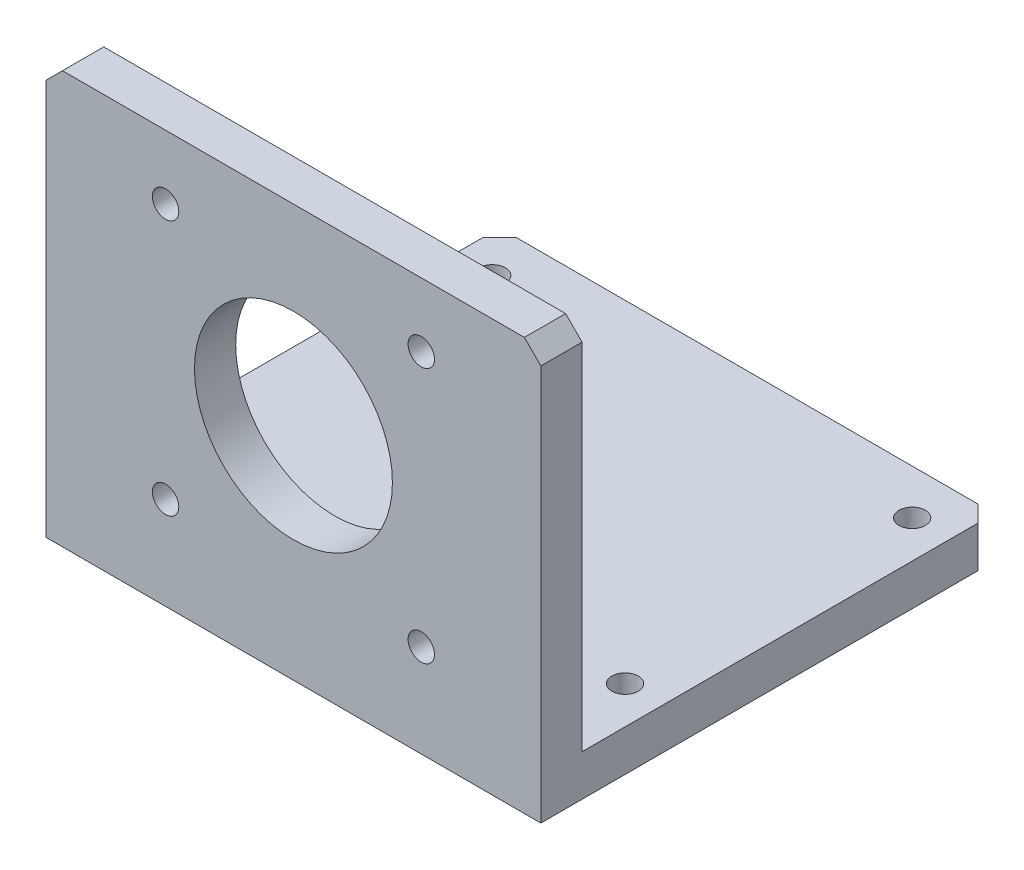
ISO-10303-21;
HEADER;
FILE_DESCRIPTION(('STEP AP214'),'2;1');
FILE_NAME('part.step','',(''),(''),'','','');
FILE_SCHEMA(('AUTOMOTIVE_DESIGN { 1 0 10303 214 1 1 1 1 }'));
ENDSEC;
DATA;
#1=APPLICATION_CONTEXT('core data for automotive mechanical design processes');
#2=APPLICATION_PROTOCOL_DEFINITION('international standard','automotive_design',2000,#1);
#3=PRODUCT_CONTEXT('',#1,'mechanical');
#4=PRODUCT('Part','Part','',(#3));
#5=PRODUCT_RELATED_PRODUCT_CATEGORY('part','',(#4));
#6=PRODUCT_DEFINITION_FORMATION('','',#4);
#7=PRODUCT_DEFINITION_CONTEXT('part definition',#1,'design');
#8=PRODUCT_DEFINITION('design','',#6,#7);
#9=PRODUCT_DEFINITION_SHAPE('','',#8);
#10=(LENGTH_UNIT() NAMED_UNIT(*) SI_UNIT(.MILLI.,.METRE.));
#11=(NAMED_UNIT(*) PLANE_ANGLE_UNIT() SI_UNIT($,.RADIAN.));
#12=(NAMED_UNIT(*) SI_UNIT($,.STERADIAN.) SOLID_ANGLE_UNIT());
#13=UNCERTAINTY_MEASURE_WITH_UNIT(LENGTH_MEASURE(1.E-05),#10,'distance_accuracy_value','');
#14=(GEOMETRIC_REPRESENTATION_CONTEXT(3) GLOBAL_UNCERTAINTY_ASSIGNED_CONTEXT((#13)) GLOBAL_UNIT_ASSIGNED_CONTEXT((#10,
#11,#12)) REPRESENTATION_CONTEXT('',''));
#15=CARTESIAN_POINT('',(0.,0.,0.));
#16=DIRECTION('',(0.,0.,1.));
#17=DIRECTION('',(1.,0.,0.));
#18=AXIS2_PLACEMENT_3D('',#15,#16,#17);
#19=CARTESIAN_POINT('',(60.,5.,-5.));
#20=DIRECTION('',(0.,-1.,0.));
#21=DIRECTION('',(0.,0.,-1.));
#22=AXIS2_PLACEMENT_3D('',#19,#20,#21);
#23=PLANE('',#22);
#24=CARTESIAN_POINT('',(55.4592592592593,5.,-14.7490421455937));
#25=DIRECTION('',(0.,1.,0.));
#26=DIRECTION('',(0.,0.,1.));
#27=AXIS2_PLACEMENT_3D('',#24,#25,#26);
#28=CIRCLE('',#27,1.60000000000002);
#29=CARTESIAN_POINT('',(55.4592592592593,5.,-13.1490421455937));
#30=VERTEX_POINT('',#29);
#31=EDGE_CURVE('E305',#30,#30,#28,.T.);
#32=ORIENTED_EDGE('',*,*,#31,.F.);
#33=EDGE_LOOP('',(#32));
#34=FACE_BOUND('',#33,.T.);
#35=CARTESIAN_POINT('',(4.54074074074073,5.,-49.5574712643677));
#36=DIRECTION('',(0.,1.,0.));
#37=DIRECTION('',(0.,0.,1.));
#38=AXIS2_PLACEMENT_3D('',#35,#36,#37);
#39=CIRCLE('',#38,1.60000000000001);
#40=CARTESIAN_POINT('',(4.54074074074073,5.,-47.9574712643676));
#41=VERTEX_POINT('',#40);
#42=EDGE_CURVE('E281',#41,#41,#39,.T.);
#43=ORIENTED_EDGE('',*,*,#42,.F.);
#44=EDGE_LOOP('',(#43));
#45=FACE_BOUND('',#44,.T.);
#46=CARTESIAN_POINT('',(4.54074074074073,5.,-14.7490421455937));
#47=DIRECTION('',(0.,1.,0.));
#48=DIRECTION('',(0.,0.,1.));
#49=AXIS2_PLACEMENT_3D('',#46,#47,#48);
#50=CIRCLE('',#49,1.60000000000001);
#51=CARTESIAN_POINT('',(4.54074074074073,5.,-13.1490421455937));
#52=VERTEX_POINT('',#51);
#53=EDGE_CURVE('E289',#52,#52,#50,.T.);
#54=ORIENTED_EDGE('',*,*,#53,.F.);
#55=EDGE_LOOP('',(#54));
#56=FACE_BOUND('',#55,.T.);
#57=CARTESIAN_POINT('',(55.4592592592593,5.,-49.5574712643677));
#58=DIRECTION('',(0.,1.,0.));
#59=DIRECTION('',(0.,0.,1.));
#60=AXIS2_PLACEMENT_3D('',#57,#58,#59);
#61=CIRCLE('',#60,1.60000000000002);
#62=CARTESIAN_POINT('',(55.4592592592593,5.,-47.9574712643676));
#63=VERTEX_POINT('',#62);
#64=EDGE_CURVE('E297',#63,#63,#61,.T.);
#65=ORIENTED_EDGE('',*,*,#64,.F.);
#66=EDGE_LOOP('',(#65));
#67=FACE_BOUND('',#66,.T.);
#68=DIRECTION('',(0.,0.,1.));
#69=VECTOR('',#68,1.);
#70=CARTESIAN_POINT('',(60.,5.,-5.));
#71=LINE('',#70,#69);
#72=CARTESIAN_POINT('',(60.,5.,-53.));
#73=VERTEX_POINT('',#72);
#74=CARTESIAN_POINT('',(60.,5.,-5.));
#75=VERTEX_POINT('',#74);
#76=EDGE_CURVE('E119',#73,#75,#71,.T.);
#77=ORIENTED_EDGE('',*,*,#76,.F.);
#78=DIRECTION('',(0.707106781186548,0.,0.707106781186548));
#79=VECTOR('',#78,1.);
#80=CARTESIAN_POINT('',(58.,5.,-55.));
#81=LINE('',#80,#79);
#82=CARTESIAN_POINT('',(58.,5.,-55.));
#83=VERTEX_POINT('',#82);
#84=EDGE_CURVE('E212',#73,#83,#81,.F.);
#85=ORIENTED_EDGE('',*,*,#84,.T.);
#86=DIRECTION('',(1.,0.,0.));
#87=VECTOR('',#86,1.);
#88=CARTESIAN_POINT('',(60.,5.,-55.));
#89=LINE('',#88,#87);
#90=CARTESIAN_POINT('',(2.00000000000002,5.,-55.));
#91=VERTEX_POINT('',#90);
#92=EDGE_CURVE('E309',#91,#83,#89,.T.);
#93=ORIENTED_EDGE('',*,*,#92,.F.);
#94=DIRECTION('',(-0.707106781186548,0.,0.707106781186548));
#95=VECTOR('',#94,1.);
#96=CARTESIAN_POINT('',(2.00000000000002,5.,-55.));
#97=LINE('',#96,#95);
#98=CARTESIAN_POINT('',(0.,5.,-53.));
#99=VERTEX_POINT('',#98);
#100=EDGE_CURVE('E209',#91,#99,#97,.T.);
#101=ORIENTED_EDGE('',*,*,#100,.T.);
#102=DIRECTION('',(0.,0.,1.));
#103=VECTOR('',#102,1.);
#104=CARTESIAN_POINT('',(0.,5.,-5.));
#105=LINE('',#104,#103);
#106=CARTESIAN_POINT('',(0.,5.,-5.));
#107=VERTEX_POINT('',#106);
#108=EDGE_CURVE('E137',#99,#107,#105,.T.);
#109=ORIENTED_EDGE('',*,*,#108,.T.);
#110=DIRECTION('',(-1.,0.,0.));
#111=VECTOR('',#110,1.);
#112=CARTESIAN_POINT('',(60.,5.,-5.));
#113=LINE('',#112,#111);
#114=EDGE_CURVE('E135',#75,#107,#113,.T.);
#115=ORIENTED_EDGE('',*,*,#114,.F.);
#116=EDGE_LOOP('',(#77,#85,#93,#101,#109,#115));
#117=FACE_BOUND('',#116,.T.);
#118=ADVANCED_FACE('F40',(#34,#45,#56,#67,#117),#23,.F.);
#119=CARTESIAN_POINT('',(60.,0.,0.));
#120=DIRECTION('',(0.,1.,0.));
#121=DIRECTION('',(0.,0.,1.));
#122=AXIS2_PLACEMENT_3D('',#119,#120,#121);
#123=PLANE('',#122);
#124=CARTESIAN_POINT('',(4.54074074074073,0.,-49.5574712643677));
#125=DIRECTION('',(0.,1.,0.));
#126=DIRECTION('',(0.,0.,1.));
#127=AXIS2_PLACEMENT_3D('',#124,#125,#126);
#128=CIRCLE('',#127,1.60000000000001);
#129=CARTESIAN_POINT('',(4.54074074074073,0.,-47.9574712643676));
#130=VERTEX_POINT('',#129);
#131=EDGE_CURVE('E277',#130,#130,#128,.T.);
#132=ORIENTED_EDGE('',*,*,#131,.T.);
#133=EDGE_LOOP('',(#132));
#134=FACE_BOUND('',#133,.T.);
#135=CARTESIAN_POINT('',(4.54074074074073,0.,-14.7490421455937));
#136=DIRECTION('',(0.,1.,0.));
#137=DIRECTION('',(0.,0.,1.));
#138=AXIS2_PLACEMENT_3D('',#135,#136,#137);
#139=CIRCLE('',#138,1.60000000000001);
#140=CARTESIAN_POINT('',(4.54074074074073,0.,-13.1490421455937));
#141=VERTEX_POINT('',#140);
#142=EDGE_CURVE('E285',#141,#141,#139,.T.);
#143=ORIENTED_EDGE('',*,*,#142,.T.);
#144=EDGE_LOOP('',(#143));
#145=FACE_BOUND('',#144,.T.);
#146=CARTESIAN_POINT('',(55.4592592592593,0.,-49.5574712643677));
#147=DIRECTION('',(0.,1.,0.));
#148=DIRECTION('',(0.,0.,1.));
#149=AXIS2_PLACEMENT_3D('',#146,#147,#148);
#150=CIRCLE('',#149,1.60000000000001);
#151=CARTESIAN_POINT('',(55.4592592592593,0.,-47.9574712643676));
#152=VERTEX_POINT('',#151);
#153=EDGE_CURVE('E293',#152,#152,#150,.T.);
#154=ORIENTED_EDGE('',*,*,#153,.T.);
#155=EDGE_LOOP('',(#154));
#156=FACE_BOUND('',#155,.T.);
#157=CARTESIAN_POINT('',(55.4592592592593,0.,-14.7490421455937));
#158=DIRECTION('',(0.,1.,0.));
#159=DIRECTION('',(0.,0.,1.));
#160=AXIS2_PLACEMENT_3D('',#157,#158,#159);
#161=CIRCLE('',#160,1.60000000000001);
#162=CARTESIAN_POINT('',(55.4592592592593,0.,-13.1490421455937));
#163=VERTEX_POINT('',#162);
#164=EDGE_CURVE('E301',#163,#163,#161,.T.);
#165=ORIENTED_EDGE('',*,*,#164,.T.);
#166=EDGE_LOOP('',(#165));
#167=FACE_BOUND('',#166,.T.);
#168=DIRECTION('',(-1.,0.,0.));
#169=VECTOR('',#168,1.);
#170=CARTESIAN_POINT('',(60.,0.,-55.));
#171=LINE('',#170,#169);
#172=CARTESIAN_POINT('',(58.,0.,-55.));
#173=VERTEX_POINT('',#172);
#174=CARTESIAN_POINT('',(2.00000000000002,0.,-55.));
#175=VERTEX_POINT('',#174);
#176=EDGE_CURVE('E313',#173,#175,#171,.T.);
#177=ORIENTED_EDGE('',*,*,#176,.F.);
#178=DIRECTION('',(-0.707106781186548,0.,-0.707106781186548));
#179=VECTOR('',#178,1.);
#180=CARTESIAN_POINT('',(58.,0.,-55.));
#181=LINE('',#180,#179);
#182=CARTESIAN_POINT('',(60.,0.,-53.));
#183=VERTEX_POINT('',#182);
#184=EDGE_CURVE('E201',#173,#183,#181,.F.);
#185=ORIENTED_EDGE('',*,*,#184,.T.);
#186=DIRECTION('',(0.,0.,-1.));
#187=VECTOR('',#186,1.);
#188=CARTESIAN_POINT('',(60.,0.,0.));
#189=LINE('',#188,#187);
#190=CARTESIAN_POINT('',(60.,0.,0.));
#191=VERTEX_POINT('',#190);
#192=EDGE_CURVE('E132',#191,#183,#189,.T.);
#193=ORIENTED_EDGE('',*,*,#192,.F.);
#194=DIRECTION('',(-1.,0.,0.));
#195=VECTOR('',#194,1.);
#196=CARTESIAN_POINT('',(60.,0.,0.));
#197=LINE('',#196,#195);
#198=CARTESIAN_POINT('',(0.,0.,0.));
#199=VERTEX_POINT('',#198);
#200=EDGE_CURVE('E149',#191,#199,#197,.T.);
#201=ORIENTED_EDGE('',*,*,#200,.T.);
#202=DIRECTION('',(0.,0.,-1.));
#203=VECTOR('',#202,1.);
#204=CARTESIAN_POINT('',(0.,0.,0.));
#205=LINE('',#204,#203);
#206=CARTESIAN_POINT('',(0.,0.,-53.));
#207=VERTEX_POINT('',#206);
#208=EDGE_CURVE('E153',#199,#207,#205,.T.);
#209=ORIENTED_EDGE('',*,*,#208,.T.);
#210=DIRECTION('',(0.707106781186548,0.,-0.707106781186548));
#211=VECTOR('',#210,1.);
#212=CARTESIAN_POINT('',(2.00000000000002,0.,-55.));
#213=LINE('',#212,#211);
#214=EDGE_CURVE('E198',#207,#175,#213,.T.);
#215=ORIENTED_EDGE('',*,*,#214,.T.);
#216=EDGE_LOOP('',(#177,#185,#193,#201,#209,#215));
#217=FACE_BOUND('',#216,.T.);
#218=ADVANCED_FACE('F251',(#134,#145,#156,#167,#217),#123,.F.);
#219=CARTESIAN_POINT('',(60.,0.,0.));
#220=DIRECTION('',(1.,0.,0.));
#221=DIRECTION('',(0.,0.,-1.));
#222=AXIS2_PLACEMENT_3D('',#219,#220,#221);
#223=PLANE('',#222);
#224=ORIENTED_EDGE('',*,*,#192,.T.);
#225=DIRECTION('',(0.,1.,0.));
#226=VECTOR('',#225,1.);
#227=CARTESIAN_POINT('',(60.,0.,-53.));
#228=LINE('',#227,#226);
#229=EDGE_CURVE('E128',#183,#73,#228,.T.);
#230=ORIENTED_EDGE('',*,*,#229,.T.);
#231=ORIENTED_EDGE('',*,*,#76,.T.);
#232=DIRECTION('',(0.,1.,0.));
#233=VECTOR('',#232,1.);
#234=CARTESIAN_POINT('',(60.,50.,-5.));
#235=LINE('',#234,#233);
#236=CARTESIAN_POINT('',(60.,48.,-5.));
#237=VERTEX_POINT('',#236);
#238=EDGE_CURVE('E125',#75,#237,#235,.T.);
#239=ORIENTED_EDGE('',*,*,#238,.T.);
#240=DIRECTION('',(0.,0.,1.));
#241=VECTOR('',#240,1.);
#242=CARTESIAN_POINT('',(60.,48.,0.));
#243=LINE('',#242,#241);
#244=CARTESIAN_POINT('',(60.,48.,0.));
#245=VERTEX_POINT('',#244);
#246=EDGE_CURVE('E204',#237,#245,#243,.T.);
#247=ORIENTED_EDGE('',*,*,#246,.T.);
#248=DIRECTION('',(0.,-1.,0.));
#249=VECTOR('',#248,1.);
#250=CARTESIAN_POINT('',(60.,0.,0.));
#251=LINE('',#250,#249);
#252=EDGE_CURVE('E146',#245,#191,#251,.T.);
#253=ORIENTED_EDGE('',*,*,#252,.T.);
#254=EDGE_LOOP('',(#224,#230,#231,#239,#247,#253));
#255=FACE_BOUND('',#254,.T.);
#256=ADVANCED_FACE('F122',(#255),#223,.T.);
#257=CARTESIAN_POINT('',(0.,0.,0.));
#258=DIRECTION('',(1.,0.,0.));
#259=DIRECTION('',(0.,0.,-1.));
#260=AXIS2_PLACEMENT_3D('',#257,#258,#259);
#261=PLANE('',#260);
#262=ORIENTED_EDGE('',*,*,#108,.F.);
#263=DIRECTION('',(0.,-1.,0.));
#264=VECTOR('',#263,1.);
#265=CARTESIAN_POINT('',(0.,0.,-53.));
#266=LINE('',#265,#264);
#267=EDGE_CURVE('E218',#99,#207,#266,.T.);
#268=ORIENTED_EDGE('',*,*,#267,.T.);
#269=ORIENTED_EDGE('',*,*,#208,.F.);
#270=DIRECTION('',(0.,-1.,0.));
#271=VECTOR('',#270,1.);
#272=CARTESIAN_POINT('',(0.,0.,0.));
#273=LINE('',#272,#271);
#274=CARTESIAN_POINT('',(0.,48.,0.));
#275=VERTEX_POINT('',#274);
#276=EDGE_CURVE('E163',#275,#199,#273,.T.);
#277=ORIENTED_EDGE('',*,*,#276,.F.);
#278=DIRECTION('',(0.,0.,-1.));
#279=VECTOR('',#278,1.);
#280=CARTESIAN_POINT('',(0.,48.,0.));
#281=LINE('',#280,#279);
#282=CARTESIAN_POINT('',(0.,48.,-5.));
#283=VERTEX_POINT('',#282);
#284=EDGE_CURVE('E215',#275,#283,#281,.T.);
#285=ORIENTED_EDGE('',*,*,#284,.T.);
#286=DIRECTION('',(0.,1.,0.));
#287=VECTOR('',#286,1.);
#288=CARTESIAN_POINT('',(0.,50.,-5.));
#289=LINE('',#288,#287);
#290=EDGE_CURVE('E160',#107,#283,#289,.T.);
#291=ORIENTED_EDGE('',*,*,#290,.F.);
#292=EDGE_LOOP('',(#262,#268,#269,#277,#285,#291));
#293=FACE_BOUND('',#292,.T.);
#294=ADVANCED_FACE('F243',(#293),#261,.F.);
#295=CARTESIAN_POINT('',(60.,0.,0.));
#296=DIRECTION('',(0.,0.,-1.));
#297=DIRECTION('',(-1.,0.,0.));
#298=AXIS2_PLACEMENT_3D('',#295,#296,#297);
#299=PLANE('',#298);
#300=CARTESIAN_POINT('',(14.5,42.25,0.));
#301=DIRECTION('',(0.,0.,1.));
#302=DIRECTION('',(1.,0.,0.));
#303=AXIS2_PLACEMENT_3D('',#300,#301,#302);
#304=CIRCLE('',#303,1.60000000000001);
#305=CARTESIAN_POINT('',(16.1,42.25,0.));
#306=VERTEX_POINT('',#305);
#307=EDGE_CURVE('E190',#306,#306,#304,.T.);
#308=ORIENTED_EDGE('',*,*,#307,.F.);
#309=EDGE_LOOP('',(#308));
#310=FACE_BOUND('',#309,.T.);
#311=CARTESIAN_POINT('',(45.5,42.25,0.));
#312=DIRECTION('',(0.,0.,1.));
#313=DIRECTION('',(1.,0.,0.));
#314=AXIS2_PLACEMENT_3D('',#311,#312,#313);
#315=CIRCLE('',#314,1.60000000000001);
#316=CARTESIAN_POINT('',(47.1,42.25,0.));
#317=VERTEX_POINT('',#316);
#318=EDGE_CURVE('E185',#317,#317,#315,.T.);
#319=ORIENTED_EDGE('',*,*,#318,.F.);
#320=EDGE_LOOP('',(#319));
#321=FACE_BOUND('',#320,.T.);
#322=CARTESIAN_POINT('',(45.5,11.25,0.));
#323=DIRECTION('',(0.,0.,1.));
#324=DIRECTION('',(1.,0.,0.));
#325=AXIS2_PLACEMENT_3D('',#322,#323,#324);
#326=CIRCLE('',#325,1.60000000000001);
#327=CARTESIAN_POINT('',(47.1,11.25,0.));
#328=VERTEX_POINT('',#327);
#329=EDGE_CURVE('E180',#328,#328,#326,.T.);
#330=ORIENTED_EDGE('',*,*,#329,.F.);
#331=EDGE_LOOP('',(#330));
#332=FACE_BOUND('',#331,.T.);
#333=CARTESIAN_POINT('',(14.5,11.25,0.));
#334=DIRECTION('',(0.,0.,1.));
#335=DIRECTION('',(1.,0.,0.));
#336=AXIS2_PLACEMENT_3D('',#333,#334,#335);
#337=CIRCLE('',#336,1.60000000000001);
#338=CARTESIAN_POINT('',(16.1,11.25,0.));
#339=VERTEX_POINT('',#338);
#340=EDGE_CURVE('E179',#339,#339,#337,.T.);
#341=ORIENTED_EDGE('',*,*,#340,.F.);
#342=EDGE_LOOP('',(#341));
#343=FACE_BOUND('',#342,.T.);
#344=DIRECTION('',(-1.,0.,0.));
#345=VECTOR('',#344,1.);
#346=CARTESIAN_POINT('',(60.,50.,0.));
#347=LINE('',#346,#345);
#348=CARTESIAN_POINT('',(58.,50.,0.));
#349=VERTEX_POINT('',#348);
#350=CARTESIAN_POINT('',(2.00000000000002,50.,0.));
#351=VERTEX_POINT('',#350);
#352=EDGE_CURVE('E169',#349,#351,#347,.T.);
#353=ORIENTED_EDGE('',*,*,#352,.T.);
#354=DIRECTION('',(0.707106781186547,0.707106781186547,0.));
#355=VECTOR('',#354,1.);
#356=CARTESIAN_POINT('',(2.00000000000002,50.,0.));
#357=LINE('',#356,#355);
#358=EDGE_CURVE('E230',#351,#275,#357,.F.);
#359=ORIENTED_EDGE('',*,*,#358,.T.);
#360=ORIENTED_EDGE('',*,*,#276,.T.);
#361=ORIENTED_EDGE('',*,*,#200,.F.);
#362=ORIENTED_EDGE('',*,*,#252,.F.);
#363=DIRECTION('',(-0.707106781186547,0.707106781186547,0.));
#364=VECTOR('',#363,1.);
#365=CARTESIAN_POINT('',(60.,48.,0.));
#366=LINE('',#365,#364);
#367=EDGE_CURVE('E227',#245,#349,#366,.T.);
#368=ORIENTED_EDGE('',*,*,#367,.T.);
#369=EDGE_LOOP('',(#353,#359,#360,#361,#362,#368));
#370=FACE_BOUND('',#369,.T.);
#371=CARTESIAN_POINT('',(30.,26.75,0.));
#372=DIRECTION('',(0.,0.,1.));
#373=DIRECTION('',(1.,0.,0.));
#374=AXIS2_PLACEMENT_3D('',#371,#372,#373);
#375=CIRCLE('',#374,12.);
#376=CARTESIAN_POINT('',(42.,26.75,0.));
#377=VERTEX_POINT('',#376);
#378=EDGE_CURVE('E257',#377,#377,#375,.T.);
#379=ORIENTED_EDGE('',*,*,#378,.F.);
#380=EDGE_LOOP('',(#379));
#381=FACE_BOUND('',#380,.T.);
#382=ADVANCED_FACE('F235',(#310,#321,#332,#343,#370,#381),#299,.F.);
#383=CARTESIAN_POINT('',(60.,50.,-5.));
#384=DIRECTION('',(0.,0.,1.));
#385=DIRECTION('',(0.,-1.,0.));
#386=AXIS2_PLACEMENT_3D('',#383,#384,#385);
#387=PLANE('',#386);
#388=CARTESIAN_POINT('',(14.5,42.25,-5.));
#389=DIRECTION('',(0.,0.,1.));
#390=DIRECTION('',(0.,-1.,0.));
#391=AXIS2_PLACEMENT_3D('',#388,#389,#390);
#392=CIRCLE('',#391,1.60000000000001);
#393=CARTESIAN_POINT('',(14.5,40.65,-5.));
#394=VERTEX_POINT('',#393);
#395=EDGE_CURVE('E186',#394,#394,#392,.T.);
#396=ORIENTED_EDGE('',*,*,#395,.T.);
#397=EDGE_LOOP('',(#396));
#398=FACE_BOUND('',#397,.T.);
#399=CARTESIAN_POINT('',(45.5,42.25,-5.));
#400=DIRECTION('',(0.,0.,1.));
#401=DIRECTION('',(0.,-1.,0.));
#402=AXIS2_PLACEMENT_3D('',#399,#400,#401);
#403=CIRCLE('',#402,1.60000000000001);
#404=CARTESIAN_POINT('',(45.5,40.65,-5.));
#405=VERTEX_POINT('',#404);
#406=EDGE_CURVE('E181',#405,#405,#403,.T.);
#407=ORIENTED_EDGE('',*,*,#406,.T.);
#408=EDGE_LOOP('',(#407));
#409=FACE_BOUND('',#408,.T.);
#410=CARTESIAN_POINT('',(45.5,11.25,-5.));
#411=DIRECTION('',(0.,0.,1.));
#412=DIRECTION('',(0.,-1.,0.));
#413=AXIS2_PLACEMENT_3D('',#410,#411,#412);
#414=CIRCLE('',#413,1.60000000000001);
#415=CARTESIAN_POINT('',(45.5,9.65000000000002,-5.));
#416=VERTEX_POINT('',#415);
#417=EDGE_CURVE('E175',#416,#416,#414,.T.);
#418=ORIENTED_EDGE('',*,*,#417,.T.);
#419=EDGE_LOOP('',(#418));
#420=FACE_BOUND('',#419,.T.);
#421=CARTESIAN_POINT('',(14.5,11.25,-5.));
#422=DIRECTION('',(0.,0.,1.));
#423=DIRECTION('',(0.,-1.,0.));
#424=AXIS2_PLACEMENT_3D('',#421,#422,#423);
#425=CIRCLE('',#424,1.60000000000001);
#426=CARTESIAN_POINT('',(14.5,9.65000000000002,-5.));
#427=VERTEX_POINT('',#426);
#428=EDGE_CURVE('E261',#427,#427,#425,.T.);
#429=ORIENTED_EDGE('',*,*,#428,.T.);
#430=EDGE_LOOP('',(#429));
#431=FACE_BOUND('',#430,.T.);
#432=CARTESIAN_POINT('',(30.,26.75,-5.));
#433=DIRECTION('',(0.,0.,1.));
#434=DIRECTION('',(0.,-1.,0.));
#435=AXIS2_PLACEMENT_3D('',#432,#433,#434);
#436=CIRCLE('',#435,12.);
#437=CARTESIAN_POINT('',(30.,14.75,-5.));
#438=VERTEX_POINT('',#437);
#439=EDGE_CURVE('E157',#438,#438,#436,.T.);
#440=ORIENTED_EDGE('',*,*,#439,.T.);
#441=EDGE_LOOP('',(#440));
#442=FACE_BOUND('',#441,.T.);
#443=ORIENTED_EDGE('',*,*,#290,.T.);
#444=DIRECTION('',(-0.707106781186547,-0.707106781186547,0.));
#445=VECTOR('',#444,1.);
#446=CARTESIAN_POINT('',(2.00000000000002,50.,-5.));
#447=LINE('',#446,#445);
#448=CARTESIAN_POINT('',(2.00000000000002,50.,-5.));
#449=VERTEX_POINT('',#448);
#450=EDGE_CURVE('E11',#283,#449,#447,.F.);
#451=ORIENTED_EDGE('',*,*,#450,.T.);
#452=DIRECTION('',(-1.,0.,0.));
#453=VECTOR('',#452,1.);
#454=CARTESIAN_POINT('',(60.,50.,-5.));
#455=LINE('',#454,#453);
#456=CARTESIAN_POINT('',(58.,50.,-5.));
#457=VERTEX_POINT('',#456);
#458=EDGE_CURVE('E141',#457,#449,#455,.T.);
#459=ORIENTED_EDGE('',*,*,#458,.F.);
#460=DIRECTION('',(0.707106781186547,-0.707106781186547,0.));
#461=VECTOR('',#460,1.);
#462=CARTESIAN_POINT('',(60.,48.,-5.));
#463=LINE('',#462,#461);
#464=EDGE_CURVE('E50',#457,#237,#463,.T.);
#465=ORIENTED_EDGE('',*,*,#464,.T.);
#466=ORIENTED_EDGE('',*,*,#238,.F.);
#467=ORIENTED_EDGE('',*,*,#114,.T.);
#468=EDGE_LOOP('',(#443,#451,#459,#465,#466,#467));
#469=FACE_BOUND('',#468,.T.);
#470=ADVANCED_FACE('F143',(#398,#409,#420,#431,#442,#469),#387,.F.);
#471=CARTESIAN_POINT('',(60.,50.,0.));
#472=DIRECTION('',(0.,-1.,0.));
#473=DIRECTION('',(0.,0.,-1.));
#474=AXIS2_PLACEMENT_3D('',#471,#472,#473);
#475=PLANE('',#474);
#476=ORIENTED_EDGE('',*,*,#458,.T.);
#477=DIRECTION('',(0.,0.,1.));
#478=VECTOR('',#477,1.);
#479=CARTESIAN_POINT('',(2.00000000000002,50.,0.));
#480=LINE('',#479,#478);
#481=EDGE_CURVE('E223',#449,#351,#480,.T.);
#482=ORIENTED_EDGE('',*,*,#481,.T.);
#483=ORIENTED_EDGE('',*,*,#352,.F.);
#484=DIRECTION('',(0.,0.,-1.));
#485=VECTOR('',#484,1.);
#486=CARTESIAN_POINT('',(58.,50.,-5.));
#487=LINE('',#486,#485);
#488=EDGE_CURVE('E62',#349,#457,#487,.T.);
#489=ORIENTED_EDGE('',*,*,#488,.T.);
#490=EDGE_LOOP('',(#476,#482,#483,#489));
#491=FACE_BOUND('',#490,.T.);
#492=ADVANCED_FACE('F245',(#491),#475,.F.);
#493=CARTESIAN_POINT('',(30.,26.75,0.));
#494=DIRECTION('',(0.,0.,1.));
#495=DIRECTION('',(1.,0.,0.));
#496=AXIS2_PLACEMENT_3D('',#493,#494,#495);
#497=CYLINDRICAL_SURFACE('',#496,12.);
#498=ORIENTED_EDGE('',*,*,#378,.T.);
#499=EDGE_LOOP('',(#498));
#500=FACE_BOUND('',#499,.T.);
#501=ORIENTED_EDGE('',*,*,#439,.F.);
#502=EDGE_LOOP('',(#501));
#503=FACE_BOUND('',#502,.T.);
#504=ADVANCED_FACE('F354',(#500,#503),#497,.F.);
#505=CARTESIAN_POINT('',(14.5,11.25,0.));
#506=DIRECTION('',(0.,0.,1.));
#507=DIRECTION('',(1.,0.,0.));
#508=AXIS2_PLACEMENT_3D('',#505,#506,#507);
#509=CYLINDRICAL_SURFACE('',#508,1.60000000000001);
#510=ORIENTED_EDGE('',*,*,#340,.T.);
#511=EDGE_LOOP('',(#510));
#512=FACE_BOUND('',#511,.T.);
#513=ORIENTED_EDGE('',*,*,#428,.F.);
#514=EDGE_LOOP('',(#513));
#515=FACE_BOUND('',#514,.T.);
#516=ADVANCED_FACE('F364',(#512,#515),#509,.F.);
#517=CARTESIAN_POINT('',(45.5,11.25,0.));
#518=DIRECTION('',(0.,0.,1.));
#519=DIRECTION('',(1.,0.,0.));
#520=AXIS2_PLACEMENT_3D('',#517,#518,#519);
#521=CYLINDRICAL_SURFACE('',#520,1.60000000000001);
#522=ORIENTED_EDGE('',*,*,#329,.T.);
#523=EDGE_LOOP('',(#522));
#524=FACE_BOUND('',#523,.T.);
#525=ORIENTED_EDGE('',*,*,#417,.F.);
#526=EDGE_LOOP('',(#525));
#527=FACE_BOUND('',#526,.T.);
#528=ADVANCED_FACE('F368',(#524,#527),#521,.F.);
#529=CARTESIAN_POINT('',(45.5,42.25,0.));
#530=DIRECTION('',(0.,0.,1.));
#531=DIRECTION('',(1.,0.,0.));
#532=AXIS2_PLACEMENT_3D('',#529,#530,#531);
#533=CYLINDRICAL_SURFACE('',#532,1.60000000000001);
#534=ORIENTED_EDGE('',*,*,#318,.T.);
#535=EDGE_LOOP('',(#534));
#536=FACE_BOUND('',#535,.T.);
#537=ORIENTED_EDGE('',*,*,#406,.F.);
#538=EDGE_LOOP('',(#537));
#539=FACE_BOUND('',#538,.T.);
#540=ADVANCED_FACE('F372',(#536,#539),#533,.F.);
#541=CARTESIAN_POINT('',(14.5,42.25,0.));
#542=DIRECTION('',(0.,0.,1.));
#543=DIRECTION('',(1.,0.,0.));
#544=AXIS2_PLACEMENT_3D('',#541,#542,#543);
#545=CYLINDRICAL_SURFACE('',#544,1.60000000000001);
#546=ORIENTED_EDGE('',*,*,#307,.T.);
#547=EDGE_LOOP('',(#546));
#548=FACE_BOUND('',#547,.T.);
#549=ORIENTED_EDGE('',*,*,#395,.F.);
#550=EDGE_LOOP('',(#549));
#551=FACE_BOUND('',#550,.T.);
#552=ADVANCED_FACE('F376',(#548,#551),#545,.F.);
#553=CARTESIAN_POINT('',(4.54074074074073,5.,-49.5574712643677));
#554=DIRECTION('',(0.,1.,0.));
#555=DIRECTION('',(0.,0.,1.));
#556=AXIS2_PLACEMENT_3D('',#553,#554,#555);
#557=CYLINDRICAL_SURFACE('',#556,1.60000000000001);
#558=ORIENTED_EDGE('',*,*,#131,.F.);
#559=EDGE_LOOP('',(#558));
#560=FACE_BOUND('',#559,.T.);
#561=ORIENTED_EDGE('',*,*,#42,.T.);
#562=EDGE_LOOP('',(#561));
#563=FACE_BOUND('',#562,.T.);
#564=ADVANCED_FACE('F380',(#560,#563),#557,.F.);
#565=CARTESIAN_POINT('',(4.54074074074073,5.,-14.7490421455937));
#566=DIRECTION('',(0.,1.,0.));
#567=DIRECTION('',(0.,0.,1.));
#568=AXIS2_PLACEMENT_3D('',#565,#566,#567);
#569=CYLINDRICAL_SURFACE('',#568,1.60000000000001);
#570=ORIENTED_EDGE('',*,*,#142,.F.);
#571=EDGE_LOOP('',(#570));
#572=FACE_BOUND('',#571,.T.);
#573=ORIENTED_EDGE('',*,*,#53,.T.);
#574=EDGE_LOOP('',(#573));
#575=FACE_BOUND('',#574,.T.);
#576=ADVANCED_FACE('F384',(#572,#575),#569,.F.);
#577=CARTESIAN_POINT('',(55.4592592592593,5.,-49.5574712643677));
#578=DIRECTION('',(0.,1.,0.));
#579=DIRECTION('',(0.,0.,1.));
#580=AXIS2_PLACEMENT_3D('',#577,#578,#579);
#581=CYLINDRICAL_SURFACE('',#580,1.60000000000001);
#582=ORIENTED_EDGE('',*,*,#153,.F.);
#583=EDGE_LOOP('',(#582));
#584=FACE_BOUND('',#583,.T.);
#585=ORIENTED_EDGE('',*,*,#64,.T.);
#586=EDGE_LOOP('',(#585));
#587=FACE_BOUND('',#586,.T.);
#588=ADVANCED_FACE('F388',(#584,#587),#581,.F.);
#589=CARTESIAN_POINT('',(55.4592592592593,5.,-14.7490421455937));
#590=DIRECTION('',(0.,1.,0.));
#591=DIRECTION('',(0.,0.,1.));
#592=AXIS2_PLACEMENT_3D('',#589,#590,#591);
#593=CYLINDRICAL_SURFACE('',#592,1.60000000000001);
#594=ORIENTED_EDGE('',*,*,#164,.F.);
#595=EDGE_LOOP('',(#594));
#596=FACE_BOUND('',#595,.T.);
#597=ORIENTED_EDGE('',*,*,#31,.T.);
#598=EDGE_LOOP('',(#597));
#599=FACE_BOUND('',#598,.T.);
#600=ADVANCED_FACE('F334',(#596,#599),#593,.F.);
#601=CARTESIAN_POINT('',(0.,0.,-55.));
#602=DIRECTION('',(0.,0.,-1.));
#603=DIRECTION('',(-1.,0.,0.));
#604=AXIS2_PLACEMENT_3D('',#601,#602,#603);
#605=PLANE('',#604);
#606=ORIENTED_EDGE('',*,*,#92,.T.);
#607=DIRECTION('',(0.,-1.,0.));
#608=VECTOR('',#607,1.);
#609=CARTESIAN_POINT('',(58.,0.,-55.));
#610=LINE('',#609,#608);
#611=EDGE_CURVE('E194',#83,#173,#610,.T.);
#612=ORIENTED_EDGE('',*,*,#611,.T.);
#613=ORIENTED_EDGE('',*,*,#176,.T.);
#614=DIRECTION('',(0.,1.,0.));
#615=VECTOR('',#614,1.);
#616=CARTESIAN_POINT('',(2.00000000000002,5.,-55.));
#617=LINE('',#616,#615);
#618=EDGE_CURVE('E140',#175,#91,#617,.T.);
#619=ORIENTED_EDGE('',*,*,#618,.T.);
#620=EDGE_LOOP('',(#606,#612,#613,#619));
#621=FACE_BOUND('',#620,.T.);
#622=ADVANCED_FACE('F318',(#621),#605,.T.);
#623=CARTESIAN_POINT('',(58.,0.,-55.));
#624=DIRECTION('',(-0.707106781186547,0.,0.707106781186547));
#625=DIRECTION('',(0.,-1.,0.));
#626=AXIS2_PLACEMENT_3D('',#623,#624,#625);
#627=PLANE('',#626);
#628=ORIENTED_EDGE('',*,*,#84,.F.);
#629=ORIENTED_EDGE('',*,*,#229,.F.);
#630=ORIENTED_EDGE('',*,*,#184,.F.);
#631=ORIENTED_EDGE('',*,*,#611,.F.);
#632=EDGE_LOOP('',(#628,#629,#630,#631));
#633=FACE_BOUND('',#632,.T.);
#634=ADVANCED_FACE('F326',(#633),#627,.F.);
#635=CARTESIAN_POINT('',(2.00000000000002,0.,-55.));
#636=DIRECTION('',(-0.707106781186547,0.,-0.707106781186547));
#637=DIRECTION('',(0.,-1.,0.));
#638=AXIS2_PLACEMENT_3D('',#635,#636,#637);
#639=PLANE('',#638);
#640=ORIENTED_EDGE('',*,*,#214,.F.);
#641=ORIENTED_EDGE('',*,*,#267,.F.);
#642=ORIENTED_EDGE('',*,*,#100,.F.);
#643=ORIENTED_EDGE('',*,*,#618,.F.);
#644=EDGE_LOOP('',(#640,#641,#642,#643));
#645=FACE_BOUND('',#644,.T.);
#646=ADVANCED_FACE('F323',(#645),#639,.T.);
#647=CARTESIAN_POINT('',(2.00000000000002,50.,0.));
#648=DIRECTION('',(0.707106781186547,-0.707106781186547,0.));
#649=DIRECTION('',(0.,0.,1.));
#650=AXIS2_PLACEMENT_3D('',#647,#648,#649);
#651=PLANE('',#650);
#652=ORIENTED_EDGE('',*,*,#450,.F.);
#653=ORIENTED_EDGE('',*,*,#284,.F.);
#654=ORIENTED_EDGE('',*,*,#358,.F.);
#655=ORIENTED_EDGE('',*,*,#481,.F.);
#656=EDGE_LOOP('',(#652,#653,#654,#655));
#657=FACE_BOUND('',#656,.T.);
#658=ADVANCED_FACE('F244',(#657),#651,.F.);
#659=CARTESIAN_POINT('',(60.,48.,0.));
#660=DIRECTION('',(0.707106781186547,0.707106781186547,0.));
#661=DIRECTION('',(0.,0.,-1.));
#662=AXIS2_PLACEMENT_3D('',#659,#660,#661);
#663=PLANE('',#662);
#664=ORIENTED_EDGE('',*,*,#464,.F.);
#665=ORIENTED_EDGE('',*,*,#488,.F.);
#666=ORIENTED_EDGE('',*,*,#367,.F.);
#667=ORIENTED_EDGE('',*,*,#246,.F.);
#668=EDGE_LOOP('',(#664,#665,#666,#667));
#669=FACE_BOUND('',#668,.T.);
#670=ADVANCED_FACE('F43',(#669),#663,.T.);
#671=CLOSED_SHELL('',(#118,#218,#256,#294,#382,#470,#492,#504,#516,#528,#540,#552,#564,#576,
#588,#600,#622,#634,#646,#658,#670));
#672=MANIFOLD_SOLID_BREP('B2',#671);
#673=ADVANCED_BREP_SHAPE_REPRESENTATION('',(#18,#672),#14);
#674=SHAPE_DEFINITION_REPRESENTATION(#9,#673);
ENDSEC;
END-ISO-10303-21;
